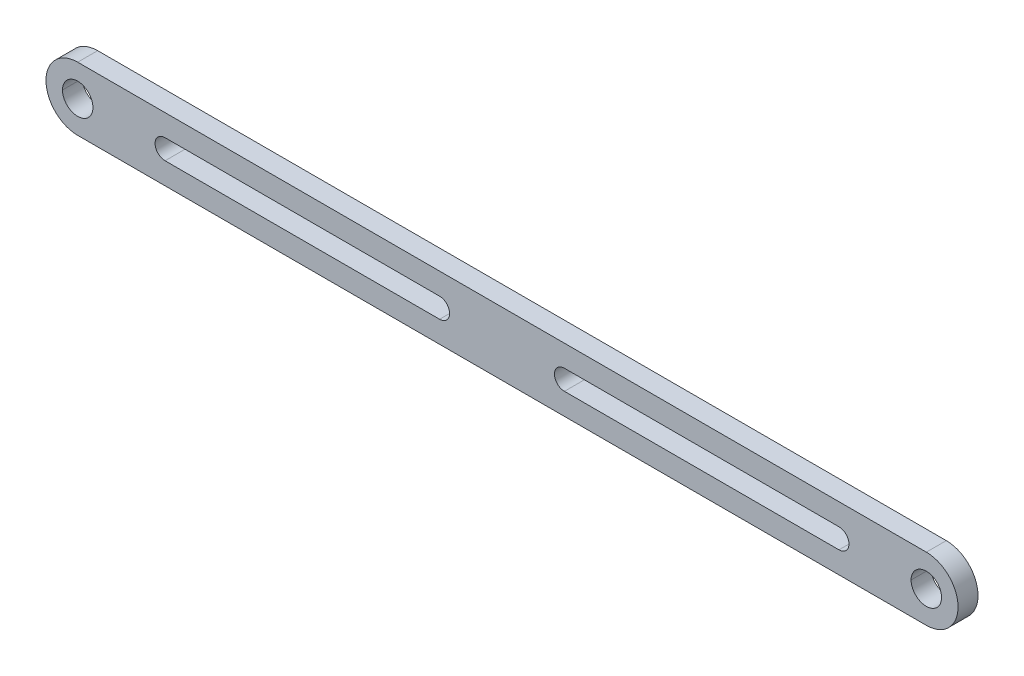
ISO-10303-21;
HEADER;
FILE_DESCRIPTION(('STEP AP214'),'2;1');
FILE_NAME('part.step','',(''),(''),'','','');
FILE_SCHEMA(('AUTOMOTIVE_DESIGN { 1 0 10303 214 1 1 1 1 }'));
ENDSEC;
DATA;
#1=APPLICATION_CONTEXT('core data for automotive mechanical design processes');
#2=APPLICATION_PROTOCOL_DEFINITION('international standard','automotive_design',2000,#1);
#3=PRODUCT_CONTEXT('',#1,'mechanical');
#4=PRODUCT('Part','Part','',(#3));
#5=PRODUCT_RELATED_PRODUCT_CATEGORY('part','',(#4));
#6=PRODUCT_DEFINITION_FORMATION('','',#4);
#7=PRODUCT_DEFINITION_CONTEXT('part definition',#1,'design');
#8=PRODUCT_DEFINITION('design','',#6,#7);
#9=PRODUCT_DEFINITION_SHAPE('','',#8);
#10=(LENGTH_UNIT() NAMED_UNIT(*) SI_UNIT(.MILLI.,.METRE.));
#11=(NAMED_UNIT(*) PLANE_ANGLE_UNIT() SI_UNIT($,.RADIAN.));
#12=(NAMED_UNIT(*) SI_UNIT($,.STERADIAN.) SOLID_ANGLE_UNIT());
#13=UNCERTAINTY_MEASURE_WITH_UNIT(LENGTH_MEASURE(1.E-05),#10,'distance_accuracy_value','');
#14=(GEOMETRIC_REPRESENTATION_CONTEXT(3) GLOBAL_UNCERTAINTY_ASSIGNED_CONTEXT((#13)) GLOBAL_UNIT_ASSIGNED_CONTEXT((#10,
#11,#12)) REPRESENTATION_CONTEXT('',''));
#15=CARTESIAN_POINT('',(0.,0.,0.));
#16=DIRECTION('',(0.,0.,1.));
#17=DIRECTION('',(1.,0.,0.));
#18=AXIS2_PLACEMENT_3D('',#15,#16,#17);
#19=CARTESIAN_POINT('',(67.5,0.,-2.));
#20=DIRECTION('',(0.,0.,1.));
#21=DIRECTION('',(1.,0.,0.));
#22=AXIS2_PLACEMENT_3D('',#19,#20,#21);
#23=CYLINDRICAL_SURFACE('',#22,2.);
#24=CARTESIAN_POINT('',(67.5,0.,-2.));
#25=DIRECTION('',(0.,0.,1.));
#26=DIRECTION('',(1.,0.,0.));
#27=AXIS2_PLACEMENT_3D('',#24,#25,#26);
#28=CIRCLE('',#27,2.);
#29=CARTESIAN_POINT('',(69.5,0.,-2.));
#30=VERTEX_POINT('',#29);
#31=CARTESIAN_POINT('',(67.5,2.,-2.));
#32=VERTEX_POINT('',#31);
#33=EDGE_CURVE('E41',#30,#32,#28,.T.);
#34=ORIENTED_EDGE('',*,*,#33,.F.);
#35=DIRECTION('',(0.,0.,1.));
#36=VECTOR('',#35,1.);
#37=CARTESIAN_POINT('',(69.5,0.,-2.));
#38=LINE('',#37,#36);
#39=CARTESIAN_POINT('',(69.5,0.,2.));
#40=VERTEX_POINT('',#39);
#41=EDGE_CURVE('E11',#30,#40,#38,.T.);
#42=ORIENTED_EDGE('',*,*,#41,.T.);
#43=CARTESIAN_POINT('',(67.5,0.,2.));
#44=DIRECTION('',(0.,0.,1.));
#45=DIRECTION('',(1.,0.,0.));
#46=AXIS2_PLACEMENT_3D('',#43,#44,#45);
#47=CIRCLE('',#46,2.);
#48=CARTESIAN_POINT('',(67.5,2.,2.));
#49=VERTEX_POINT('',#48);
#50=EDGE_CURVE('E27',#40,#49,#47,.T.);
#51=ORIENTED_EDGE('',*,*,#50,.T.);
#52=DIRECTION('',(0.,0.,1.));
#53=VECTOR('',#52,1.);
#54=CARTESIAN_POINT('',(67.5,2.,-2.));
#55=LINE('',#54,#53);
#56=EDGE_CURVE('E328',#32,#49,#55,.T.);
#57=ORIENTED_EDGE('',*,*,#56,.F.);
#58=EDGE_LOOP('',(#34,#42,#51,#57));
#59=FACE_BOUND('',#58,.T.);
#60=ADVANCED_FACE('F16',(#59),#23,.F.);
#61=CARTESIAN_POINT('',(-12.5,0.,-2.));
#62=DIRECTION('',(0.,0.,1.));
#63=DIRECTION('',(1.,0.,0.));
#64=AXIS2_PLACEMENT_3D('',#61,#62,#63);
#65=CYLINDRICAL_SURFACE('',#64,2.);
#66=CARTESIAN_POINT('',(-12.5,0.,-2.));
#67=DIRECTION('',(0.,0.,1.));
#68=DIRECTION('',(1.,0.,0.));
#69=AXIS2_PLACEMENT_3D('',#66,#67,#68);
#70=CIRCLE('',#69,2.);
#71=CARTESIAN_POINT('',(-10.5,0.,-2.));
#72=VERTEX_POINT('',#71);
#73=CARTESIAN_POINT('',(-12.5,2.,-2.));
#74=VERTEX_POINT('',#73);
#75=EDGE_CURVE('E207',#72,#74,#70,.T.);
#76=ORIENTED_EDGE('',*,*,#75,.F.);
#77=DIRECTION('',(0.,0.,1.));
#78=VECTOR('',#77,1.);
#79=CARTESIAN_POINT('',(-10.5,0.,-2.));
#80=LINE('',#79,#78);
#81=CARTESIAN_POINT('',(-10.5,0.,2.));
#82=VERTEX_POINT('',#81);
#83=EDGE_CURVE('E233',#72,#82,#80,.T.);
#84=ORIENTED_EDGE('',*,*,#83,.T.);
#85=CARTESIAN_POINT('',(-12.5,0.,2.));
#86=DIRECTION('',(0.,0.,1.));
#87=DIRECTION('',(1.,0.,0.));
#88=AXIS2_PLACEMENT_3D('',#85,#86,#87);
#89=CIRCLE('',#88,2.);
#90=CARTESIAN_POINT('',(-12.5,2.,2.));
#91=VERTEX_POINT('',#90);
#92=EDGE_CURVE('E237',#82,#91,#89,.T.);
#93=ORIENTED_EDGE('',*,*,#92,.T.);
#94=DIRECTION('',(0.,0.,1.));
#95=VECTOR('',#94,1.);
#96=CARTESIAN_POINT('',(-12.5,2.,-2.));
#97=LINE('',#96,#95);
#98=EDGE_CURVE('E266',#74,#91,#97,.T.);
#99=ORIENTED_EDGE('',*,*,#98,.F.);
#100=EDGE_LOOP('',(#76,#84,#93,#99));
#101=FACE_BOUND('',#100,.T.);
#102=ADVANCED_FACE('F424',(#101),#65,.F.);
#103=CARTESIAN_POINT('',(85.,0.,2.));
#104=DIRECTION('',(0.,0.,-1.));
#105=DIRECTION('',(-1.,0.,0.));
#106=AXIS2_PLACEMENT_3D('',#103,#104,#105);
#107=CYLINDRICAL_SURFACE('',#106,3.05);
#108=CARTESIAN_POINT('',(85.,0.,2.));
#109=DIRECTION('',(0.,0.,1.));
#110=DIRECTION('',(1.,0.,0.));
#111=AXIS2_PLACEMENT_3D('',#108,#109,#110);
#112=CIRCLE('',#111,3.05);
#113=CARTESIAN_POINT('',(81.95,0.,2.));
#114=VERTEX_POINT('',#113);
#115=CARTESIAN_POINT('',(88.05,0.,2.));
#116=VERTEX_POINT('',#115);
#117=EDGE_CURVE('E251',#114,#116,#112,.T.);
#118=ORIENTED_EDGE('',*,*,#117,.T.);
#119=DIRECTION('',(0.,0.,-1.));
#120=VECTOR('',#119,1.);
#121=CARTESIAN_POINT('',(88.05,0.,2.));
#122=LINE('',#121,#120);
#123=CARTESIAN_POINT('',(88.05,0.,-2.));
#124=VERTEX_POINT('',#123);
#125=EDGE_CURVE('E262',#116,#124,#122,.T.);
#126=ORIENTED_EDGE('',*,*,#125,.T.);
#127=CARTESIAN_POINT('',(85.,0.,-2.));
#128=DIRECTION('',(0.,0.,1.));
#129=DIRECTION('',(1.,0.,0.));
#130=AXIS2_PLACEMENT_3D('',#127,#128,#129);
#131=CIRCLE('',#130,3.05);
#132=CARTESIAN_POINT('',(81.95,0.,-2.));
#133=VERTEX_POINT('',#132);
#134=EDGE_CURVE('E183',#133,#124,#131,.T.);
#135=ORIENTED_EDGE('',*,*,#134,.F.);
#136=DIRECTION('',(0.,0.,-1.));
#137=VECTOR('',#136,1.);
#138=CARTESIAN_POINT('',(81.95,0.,2.));
#139=LINE('',#138,#137);
#140=EDGE_CURVE('E278',#114,#133,#139,.T.);
#141=ORIENTED_EDGE('',*,*,#140,.F.);
#142=EDGE_LOOP('',(#118,#126,#135,#141));
#143=FACE_BOUND('',#142,.T.);
#144=ADVANCED_FACE('F429',(#143),#107,.F.);
#145=CARTESIAN_POINT('',(-85.,0.,2.));
#146=DIRECTION('',(0.,0.,-1.));
#147=DIRECTION('',(-1.,0.,0.));
#148=AXIS2_PLACEMENT_3D('',#145,#146,#147);
#149=CYLINDRICAL_SURFACE('',#148,3.05);
#150=CARTESIAN_POINT('',(-85.,0.,2.));
#151=DIRECTION('',(0.,0.,1.));
#152=DIRECTION('',(1.,0.,0.));
#153=AXIS2_PLACEMENT_3D('',#150,#151,#152);
#154=CIRCLE('',#153,3.05);
#155=CARTESIAN_POINT('',(-88.05,0.,2.));
#156=VERTEX_POINT('',#155);
#157=CARTESIAN_POINT('',(-81.95,0.,2.));
#158=VERTEX_POINT('',#157);
#159=EDGE_CURVE('E173',#156,#158,#154,.T.);
#160=ORIENTED_EDGE('',*,*,#159,.T.);
#161=DIRECTION('',(0.,0.,-1.));
#162=VECTOR('',#161,1.);
#163=CARTESIAN_POINT('',(-81.95,0.,2.));
#164=LINE('',#163,#162);
#165=CARTESIAN_POINT('',(-81.95,0.,-2.));
#166=VERTEX_POINT('',#165);
#167=EDGE_CURVE('E170',#158,#166,#164,.T.);
#168=ORIENTED_EDGE('',*,*,#167,.T.);
#169=CARTESIAN_POINT('',(-85.,0.,-2.));
#170=DIRECTION('',(0.,0.,1.));
#171=DIRECTION('',(1.,0.,0.));
#172=AXIS2_PLACEMENT_3D('',#169,#170,#171);
#173=CIRCLE('',#172,3.05);
#174=CARTESIAN_POINT('',(-88.05,0.,-2.));
#175=VERTEX_POINT('',#174);
#176=EDGE_CURVE('E158',#175,#166,#173,.T.);
#177=ORIENTED_EDGE('',*,*,#176,.F.);
#178=DIRECTION('',(0.,0.,-1.));
#179=VECTOR('',#178,1.);
#180=CARTESIAN_POINT('',(-88.05,0.,2.));
#181=LINE('',#180,#179);
#182=EDGE_CURVE('E181',#156,#175,#181,.T.);
#183=ORIENTED_EDGE('',*,*,#182,.F.);
#184=EDGE_LOOP('',(#160,#168,#177,#183));
#185=FACE_BOUND('',#184,.T.);
#186=ADVANCED_FACE('F171',(#185),#149,.F.);
#187=CARTESIAN_POINT('',(-85.,0.,2.));
#188=DIRECTION('',(0.,0.,-1.));
#189=DIRECTION('',(-1.,0.,0.));
#190=AXIS2_PLACEMENT_3D('',#187,#188,#189);
#191=CYLINDRICAL_SURFACE('',#190,6.35);
#192=CARTESIAN_POINT('',(-85.,0.,2.));
#193=DIRECTION('',(0.,0.,1.));
#194=DIRECTION('',(1.,0.,0.));
#195=AXIS2_PLACEMENT_3D('',#192,#193,#194);
#196=CIRCLE('',#195,6.35);
#197=CARTESIAN_POINT('',(-91.35,0.,2.));
#198=VERTEX_POINT('',#197);
#199=CARTESIAN_POINT('',(-85.,-6.35,2.));
#200=VERTEX_POINT('',#199);
#201=EDGE_CURVE('E238',#198,#200,#196,.T.);
#202=ORIENTED_EDGE('',*,*,#201,.F.);
#203=DIRECTION('',(0.,0.,-1.));
#204=VECTOR('',#203,1.);
#205=CARTESIAN_POINT('',(-91.35,0.,2.));
#206=LINE('',#205,#204);
#207=CARTESIAN_POINT('',(-91.35,0.,-2.));
#208=VERTEX_POINT('',#207);
#209=EDGE_CURVE('E178',#198,#208,#206,.T.);
#210=ORIENTED_EDGE('',*,*,#209,.T.);
#211=CARTESIAN_POINT('',(-85.,0.,-2.));
#212=DIRECTION('',(0.,0.,1.));
#213=DIRECTION('',(1.,0.,0.));
#214=AXIS2_PLACEMENT_3D('',#211,#212,#213);
#215=CIRCLE('',#214,6.35);
#216=CARTESIAN_POINT('',(-85.,-6.35,-2.));
#217=VERTEX_POINT('',#216);
#218=EDGE_CURVE('E319',#208,#217,#215,.T.);
#219=ORIENTED_EDGE('',*,*,#218,.T.);
#220=DIRECTION('',(0.,0.,-1.));
#221=VECTOR('',#220,1.);
#222=CARTESIAN_POINT('',(-85.,-6.35,2.));
#223=LINE('',#222,#221);
#224=EDGE_CURVE('E310',#200,#217,#223,.T.);
#225=ORIENTED_EDGE('',*,*,#224,.F.);
#226=EDGE_LOOP('',(#202,#210,#219,#225));
#227=FACE_BOUND('',#226,.T.);
#228=ADVANCED_FACE('F445',(#227),#191,.T.);
#229=CARTESIAN_POINT('',(-85.,0.,2.));
#230=DIRECTION('',(0.,0.,1.));
#231=DIRECTION('',(1.,0.,0.));
#232=AXIS2_PLACEMENT_3D('',#229,#230,#231);
#233=PLANE('',#232);
#234=CARTESIAN_POINT('',(-85.,0.,2.));
#235=DIRECTION('',(0.,0.,1.));
#236=DIRECTION('',(1.,0.,0.));
#237=AXIS2_PLACEMENT_3D('',#234,#235,#236);
#238=CIRCLE('',#237,6.35);
#239=CARTESIAN_POINT('',(-85.,6.35,2.));
#240=VERTEX_POINT('',#239);
#241=EDGE_CURVE('E242',#240,#198,#238,.T.);
#242=ORIENTED_EDGE('',*,*,#241,.T.);
#243=ORIENTED_EDGE('',*,*,#201,.T.);
#244=DIRECTION('',(1.,0.,0.));
#245=VECTOR('',#244,1.);
#246=CARTESIAN_POINT('',(-85.,-6.35,2.));
#247=LINE('',#246,#245);
#248=CARTESIAN_POINT('',(85.,-6.35,2.));
#249=VERTEX_POINT('',#248);
#250=EDGE_CURVE('E243',#200,#249,#247,.T.);
#251=ORIENTED_EDGE('',*,*,#250,.T.);
#252=CARTESIAN_POINT('',(85.,0.,2.));
#253=DIRECTION('',(0.,0.,1.));
#254=DIRECTION('',(1.,0.,0.));
#255=AXIS2_PLACEMENT_3D('',#252,#253,#254);
#256=CIRCLE('',#255,6.35);
#257=CARTESIAN_POINT('',(85.,6.35,2.));
#258=VERTEX_POINT('',#257);
#259=EDGE_CURVE('E247',#249,#258,#256,.T.);
#260=ORIENTED_EDGE('',*,*,#259,.T.);
#261=DIRECTION('',(-1.,0.,0.));
#262=VECTOR('',#261,1.);
#263=CARTESIAN_POINT('',(-85.,6.35,2.));
#264=LINE('',#263,#262);
#265=EDGE_CURVE('E270',#258,#240,#264,.T.);
#266=ORIENTED_EDGE('',*,*,#265,.T.);
#267=EDGE_LOOP('',(#242,#243,#251,#260,#266));
#268=FACE_BOUND('',#267,.T.);
#269=CARTESIAN_POINT('',(67.5,0.,2.));
#270=DIRECTION('',(0.,0.,1.));
#271=DIRECTION('',(1.,0.,0.));
#272=AXIS2_PLACEMENT_3D('',#269,#270,#271);
#273=CIRCLE('',#272,2.);
#274=CARTESIAN_POINT('',(67.5,-2.,2.));
#275=VERTEX_POINT('',#274);
#276=EDGE_CURVE('E196',#275,#40,#273,.T.);
#277=ORIENTED_EDGE('',*,*,#276,.F.);
#278=DIRECTION('',(1.,0.,0.));
#279=VECTOR('',#278,1.);
#280=CARTESIAN_POINT('',(67.5,-2.,2.));
#281=LINE('',#280,#279);
#282=CARTESIAN_POINT('',(12.5,-2.,2.));
#283=VERTEX_POINT('',#282);
#284=EDGE_CURVE('E201',#283,#275,#281,.T.);
#285=ORIENTED_EDGE('',*,*,#284,.F.);
#286=CARTESIAN_POINT('',(12.5,0.,2.));
#287=DIRECTION('',(0.,0.,1.));
#288=DIRECTION('',(1.,0.,0.));
#289=AXIS2_PLACEMENT_3D('',#286,#287,#288);
#290=CIRCLE('',#289,2.);
#291=CARTESIAN_POINT('',(12.5,2.,2.));
#292=VERTEX_POINT('',#291);
#293=EDGE_CURVE('E332',#292,#283,#290,.T.);
#294=ORIENTED_EDGE('',*,*,#293,.F.);
#295=DIRECTION('',(-1.,0.,0.));
#296=VECTOR('',#295,1.);
#297=CARTESIAN_POINT('',(67.5,2.,2.));
#298=LINE('',#297,#296);
#299=EDGE_CURVE('E333',#49,#292,#298,.T.);
#300=ORIENTED_EDGE('',*,*,#299,.F.);
#301=ORIENTED_EDGE('',*,*,#50,.F.);
#302=EDGE_LOOP('',(#277,#285,#294,#300,#301));
#303=FACE_BOUND('',#302,.T.);
#304=CARTESIAN_POINT('',(-12.5,0.,2.));
#305=DIRECTION('',(0.,0.,1.));
#306=DIRECTION('',(1.,0.,0.));
#307=AXIS2_PLACEMENT_3D('',#304,#305,#306);
#308=CIRCLE('',#307,2.);
#309=CARTESIAN_POINT('',(-12.5,-2.,2.));
#310=VERTEX_POINT('',#309);
#311=EDGE_CURVE('E955',#310,#82,#308,.T.);
#312=ORIENTED_EDGE('',*,*,#311,.F.);
#313=DIRECTION('',(1.,0.,0.));
#314=VECTOR('',#313,1.);
#315=CARTESIAN_POINT('',(-12.5,-2.,2.));
#316=LINE('',#315,#314);
#317=CARTESIAN_POINT('',(-67.5,-2.,2.));
#318=VERTEX_POINT('',#317);
#319=EDGE_CURVE('E304',#318,#310,#316,.T.);
#320=ORIENTED_EDGE('',*,*,#319,.F.);
#321=CARTESIAN_POINT('',(-67.5,0.,2.));
#322=DIRECTION('',(0.,0.,1.));
#323=DIRECTION('',(1.,0.,0.));
#324=AXIS2_PLACEMENT_3D('',#321,#322,#323);
#325=CIRCLE('',#324,2.);
#326=CARTESIAN_POINT('',(-67.5,2.,2.));
#327=VERTEX_POINT('',#326);
#328=EDGE_CURVE('E305',#327,#318,#325,.T.);
#329=ORIENTED_EDGE('',*,*,#328,.F.);
#330=DIRECTION('',(-1.,0.,0.));
#331=VECTOR('',#330,1.);
#332=CARTESIAN_POINT('',(-12.5,2.,2.));
#333=LINE('',#332,#331);
#334=EDGE_CURVE('E232',#91,#327,#333,.T.);
#335=ORIENTED_EDGE('',*,*,#334,.F.);
#336=ORIENTED_EDGE('',*,*,#92,.F.);
#337=EDGE_LOOP('',(#312,#320,#329,#335,#336));
#338=FACE_BOUND('',#337,.T.);
#339=ORIENTED_EDGE('',*,*,#159,.F.);
#340=CARTESIAN_POINT('',(-85.,0.,2.));
#341=DIRECTION('',(0.,0.,1.));
#342=DIRECTION('',(1.,0.,0.));
#343=AXIS2_PLACEMENT_3D('',#340,#341,#342);
#344=CIRCLE('',#343,3.05);
#345=EDGE_CURVE('E273',#158,#156,#344,.T.);
#346=ORIENTED_EDGE('',*,*,#345,.F.);
#347=EDGE_LOOP('',(#339,#346));
#348=FACE_BOUND('',#347,.T.);
#349=ORIENTED_EDGE('',*,*,#117,.F.);
#350=CARTESIAN_POINT('',(85.,0.,2.));
#351=DIRECTION('',(0.,0.,1.));
#352=DIRECTION('',(1.,0.,0.));
#353=AXIS2_PLACEMENT_3D('',#350,#351,#352);
#354=CIRCLE('',#353,3.05);
#355=EDGE_CURVE('E274',#116,#114,#354,.T.);
#356=ORIENTED_EDGE('',*,*,#355,.F.);
#357=EDGE_LOOP('',(#349,#356));
#358=FACE_BOUND('',#357,.T.);
#359=ADVANCED_FACE('F347',(#268,#303,#338,#348,#358),#233,.T.);
#360=CARTESIAN_POINT('',(-85.,0.,-2.));
#361=DIRECTION('',(0.,0.,1.));
#362=DIRECTION('',(1.,0.,0.));
#363=AXIS2_PLACEMENT_3D('',#360,#361,#362);
#364=PLANE('',#363);
#365=CARTESIAN_POINT('',(-85.,0.,-2.));
#366=DIRECTION('',(0.,0.,1.));
#367=DIRECTION('',(1.,0.,0.));
#368=AXIS2_PLACEMENT_3D('',#365,#366,#367);
#369=CIRCLE('',#368,6.35);
#370=CARTESIAN_POINT('',(-85.,6.35,-2.));
#371=VERTEX_POINT('',#370);
#372=EDGE_CURVE('E294',#371,#208,#369,.T.);
#373=ORIENTED_EDGE('',*,*,#372,.F.);
#374=DIRECTION('',(-1.,0.,0.));
#375=VECTOR('',#374,1.);
#376=CARTESIAN_POINT('',(-85.,6.35,-2.));
#377=LINE('',#376,#375);
#378=CARTESIAN_POINT('',(85.,6.35,-2.));
#379=VERTEX_POINT('',#378);
#380=EDGE_CURVE('E20',#379,#371,#377,.T.);
#381=ORIENTED_EDGE('',*,*,#380,.F.);
#382=CARTESIAN_POINT('',(85.,0.,-2.));
#383=DIRECTION('',(0.,0.,1.));
#384=DIRECTION('',(1.,0.,0.));
#385=AXIS2_PLACEMENT_3D('',#382,#383,#384);
#386=CIRCLE('',#385,6.35);
#387=CARTESIAN_POINT('',(85.,-6.35,-2.));
#388=VERTEX_POINT('',#387);
#389=EDGE_CURVE('E299',#388,#379,#386,.T.);
#390=ORIENTED_EDGE('',*,*,#389,.F.);
#391=DIRECTION('',(1.,0.,0.));
#392=VECTOR('',#391,1.);
#393=CARTESIAN_POINT('',(-85.,-6.35,-2.));
#394=LINE('',#393,#392);
#395=EDGE_CURVE('E306',#217,#388,#394,.T.);
#396=ORIENTED_EDGE('',*,*,#395,.F.);
#397=ORIENTED_EDGE('',*,*,#218,.F.);
#398=EDGE_LOOP('',(#373,#381,#390,#396,#397));
#399=FACE_BOUND('',#398,.T.);
#400=DIRECTION('',(1.,0.,0.));
#401=VECTOR('',#400,1.);
#402=CARTESIAN_POINT('',(67.5,-2.,-2.));
#403=LINE('',#402,#401);
#404=CARTESIAN_POINT('',(12.5,-2.,-2.));
#405=VERTEX_POINT('',#404);
#406=CARTESIAN_POINT('',(67.5,-2.,-2.));
#407=VERTEX_POINT('',#406);
#408=EDGE_CURVE('E279',#405,#407,#403,.T.);
#409=ORIENTED_EDGE('',*,*,#408,.T.);
#410=CARTESIAN_POINT('',(67.5,0.,-2.));
#411=DIRECTION('',(0.,0.,1.));
#412=DIRECTION('',(1.,0.,0.));
#413=AXIS2_PLACEMENT_3D('',#410,#411,#412);
#414=CIRCLE('',#413,2.);
#415=EDGE_CURVE('E283',#407,#30,#414,.T.);
#416=ORIENTED_EDGE('',*,*,#415,.T.);
#417=ORIENTED_EDGE('',*,*,#33,.T.);
#418=DIRECTION('',(-1.,0.,0.));
#419=VECTOR('',#418,1.);
#420=CARTESIAN_POINT('',(67.5,2.,-2.));
#421=LINE('',#420,#419);
#422=CARTESIAN_POINT('',(12.5,2.,-2.));
#423=VERTEX_POINT('',#422);
#424=EDGE_CURVE('E252',#32,#423,#421,.T.);
#425=ORIENTED_EDGE('',*,*,#424,.T.);
#426=CARTESIAN_POINT('',(12.5,0.,-2.));
#427=DIRECTION('',(0.,0.,1.));
#428=DIRECTION('',(1.,0.,0.));
#429=AXIS2_PLACEMENT_3D('',#426,#427,#428);
#430=CIRCLE('',#429,2.);
#431=EDGE_CURVE('E194',#423,#405,#430,.T.);
#432=ORIENTED_EDGE('',*,*,#431,.T.);
#433=EDGE_LOOP('',(#409,#416,#417,#425,#432));
#434=FACE_BOUND('',#433,.T.);
#435=DIRECTION('',(1.,0.,0.));
#436=VECTOR('',#435,1.);
#437=CARTESIAN_POINT('',(-12.5,-2.,-2.));
#438=LINE('',#437,#436);
#439=CARTESIAN_POINT('',(-67.5,-2.,-2.));
#440=VERTEX_POINT('',#439);
#441=CARTESIAN_POINT('',(-12.5,-2.,-2.));
#442=VERTEX_POINT('',#441);
#443=EDGE_CURVE('E314',#440,#442,#438,.T.);
#444=ORIENTED_EDGE('',*,*,#443,.T.);
#445=CARTESIAN_POINT('',(-12.5,0.,-2.));
#446=DIRECTION('',(0.,0.,1.));
#447=DIRECTION('',(1.,0.,0.));
#448=AXIS2_PLACEMENT_3D('',#445,#446,#447);
#449=CIRCLE('',#448,2.);
#450=EDGE_CURVE('E217',#442,#72,#449,.T.);
#451=ORIENTED_EDGE('',*,*,#450,.T.);
#452=ORIENTED_EDGE('',*,*,#75,.T.);
#453=DIRECTION('',(-1.,0.,0.));
#454=VECTOR('',#453,1.);
#455=CARTESIAN_POINT('',(-12.5,2.,-2.));
#456=LINE('',#455,#454);
#457=CARTESIAN_POINT('',(-67.5,2.,-2.));
#458=VERTEX_POINT('',#457);
#459=EDGE_CURVE('E204',#74,#458,#456,.T.);
#460=ORIENTED_EDGE('',*,*,#459,.T.);
#461=CARTESIAN_POINT('',(-67.5,0.,-2.));
#462=DIRECTION('',(0.,0.,1.));
#463=DIRECTION('',(1.,0.,0.));
#464=AXIS2_PLACEMENT_3D('',#461,#462,#463);
#465=CIRCLE('',#464,2.);
#466=EDGE_CURVE('E167',#458,#440,#465,.T.);
#467=ORIENTED_EDGE('',*,*,#466,.T.);
#468=EDGE_LOOP('',(#444,#451,#452,#460,#467));
#469=FACE_BOUND('',#468,.T.);
#470=ORIENTED_EDGE('',*,*,#176,.T.);
#471=CARTESIAN_POINT('',(-85.,0.,-2.));
#472=DIRECTION('',(0.,0.,1.));
#473=DIRECTION('',(1.,0.,0.));
#474=AXIS2_PLACEMENT_3D('',#471,#472,#473);
#475=CIRCLE('',#474,3.05);
#476=EDGE_CURVE('E163',#166,#175,#475,.T.);
#477=ORIENTED_EDGE('',*,*,#476,.T.);
#478=EDGE_LOOP('',(#470,#477));
#479=FACE_BOUND('',#478,.T.);
#480=ORIENTED_EDGE('',*,*,#134,.T.);
#481=CARTESIAN_POINT('',(85.,0.,-2.));
#482=DIRECTION('',(0.,0.,1.));
#483=DIRECTION('',(1.,0.,0.));
#484=AXIS2_PLACEMENT_3D('',#481,#482,#483);
#485=CIRCLE('',#484,3.05);
#486=EDGE_CURVE('E190',#124,#133,#485,.T.);
#487=ORIENTED_EDGE('',*,*,#486,.T.);
#488=EDGE_LOOP('',(#480,#487));
#489=FACE_BOUND('',#488,.T.);
#490=ADVANCED_FACE('F160',(#399,#434,#469,#479,#489),#364,.F.);
#491=CARTESIAN_POINT('',(-85.,0.,2.));
#492=DIRECTION('',(0.,0.,-1.));
#493=DIRECTION('',(-1.,0.,0.));
#494=AXIS2_PLACEMENT_3D('',#491,#492,#493);
#495=CYLINDRICAL_SURFACE('',#494,6.35);
#496=ORIENTED_EDGE('',*,*,#209,.F.);
#497=ORIENTED_EDGE('',*,*,#241,.F.);
#498=DIRECTION('',(0.,0.,-1.));
#499=VECTOR('',#498,1.);
#500=CARTESIAN_POINT('',(-85.,6.35,2.));
#501=LINE('',#500,#499);
#502=EDGE_CURVE('E290',#240,#371,#501,.T.);
#503=ORIENTED_EDGE('',*,*,#502,.T.);
#504=ORIENTED_EDGE('',*,*,#372,.T.);
#505=EDGE_LOOP('',(#496,#497,#503,#504));
#506=FACE_BOUND('',#505,.T.);
#507=ADVANCED_FACE('F377',(#506),#495,.T.);
#508=CARTESIAN_POINT('',(-85.,-6.35,2.));
#509=DIRECTION('',(0.,1.,0.));
#510=DIRECTION('',(1.,0.,0.));
#511=AXIS2_PLACEMENT_3D('',#508,#509,#510);
#512=PLANE('',#511);
#513=ORIENTED_EDGE('',*,*,#395,.T.);
#514=DIRECTION('',(0.,0.,-1.));
#515=VECTOR('',#514,1.);
#516=CARTESIAN_POINT('',(85.,-6.35,2.));
#517=LINE('',#516,#515);
#518=EDGE_CURVE('E295',#249,#388,#517,.T.);
#519=ORIENTED_EDGE('',*,*,#518,.F.);
#520=ORIENTED_EDGE('',*,*,#250,.F.);
#521=ORIENTED_EDGE('',*,*,#224,.T.);
#522=EDGE_LOOP('',(#513,#519,#520,#521));
#523=FACE_BOUND('',#522,.T.);
#524=ADVANCED_FACE('F418',(#523),#512,.F.);
#525=CARTESIAN_POINT('',(85.,0.,2.));
#526=DIRECTION('',(0.,0.,-1.));
#527=DIRECTION('',(-1.,0.,0.));
#528=AXIS2_PLACEMENT_3D('',#525,#526,#527);
#529=CYLINDRICAL_SURFACE('',#528,6.35);
#530=ORIENTED_EDGE('',*,*,#389,.T.);
#531=DIRECTION('',(0.,0.,-1.));
#532=VECTOR('',#531,1.);
#533=CARTESIAN_POINT('',(85.,6.35,2.));
#534=LINE('',#533,#532);
#535=EDGE_CURVE('E315',#258,#379,#534,.T.);
#536=ORIENTED_EDGE('',*,*,#535,.F.);
#537=ORIENTED_EDGE('',*,*,#259,.F.);
#538=ORIENTED_EDGE('',*,*,#518,.T.);
#539=EDGE_LOOP('',(#530,#536,#537,#538));
#540=FACE_BOUND('',#539,.T.);
#541=ADVANCED_FACE('F409',(#540),#529,.T.);
#542=CARTESIAN_POINT('',(-85.,6.35,2.));
#543=DIRECTION('',(0.,-1.,0.));
#544=DIRECTION('',(0.,0.,-1.));
#545=AXIS2_PLACEMENT_3D('',#542,#543,#544);
#546=PLANE('',#545);
#547=ORIENTED_EDGE('',*,*,#380,.T.);
#548=ORIENTED_EDGE('',*,*,#502,.F.);
#549=ORIENTED_EDGE('',*,*,#265,.F.);
#550=ORIENTED_EDGE('',*,*,#535,.T.);
#551=EDGE_LOOP('',(#547,#548,#549,#550));
#552=FACE_BOUND('',#551,.T.);
#553=ADVANCED_FACE('F407',(#552),#546,.F.);
#554=CARTESIAN_POINT('',(-85.,0.,2.));
#555=DIRECTION('',(0.,0.,-1.));
#556=DIRECTION('',(-1.,0.,0.));
#557=AXIS2_PLACEMENT_3D('',#554,#555,#556);
#558=CYLINDRICAL_SURFACE('',#557,3.05);
#559=ORIENTED_EDGE('',*,*,#167,.F.);
#560=ORIENTED_EDGE('',*,*,#345,.T.);
#561=ORIENTED_EDGE('',*,*,#182,.T.);
#562=ORIENTED_EDGE('',*,*,#476,.F.);
#563=EDGE_LOOP('',(#559,#560,#561,#562));
#564=FACE_BOUND('',#563,.T.);
#565=ADVANCED_FACE('F180',(#564),#558,.F.);
#566=CARTESIAN_POINT('',(85.,0.,2.));
#567=DIRECTION('',(0.,0.,-1.));
#568=DIRECTION('',(-1.,0.,0.));
#569=AXIS2_PLACEMENT_3D('',#566,#567,#568);
#570=CYLINDRICAL_SURFACE('',#569,3.05);
#571=ORIENTED_EDGE('',*,*,#125,.F.);
#572=ORIENTED_EDGE('',*,*,#355,.T.);
#573=ORIENTED_EDGE('',*,*,#140,.T.);
#574=ORIENTED_EDGE('',*,*,#486,.F.);
#575=EDGE_LOOP('',(#571,#572,#573,#574));
#576=FACE_BOUND('',#575,.T.);
#577=ADVANCED_FACE('F416',(#576),#570,.F.);
#578=CARTESIAN_POINT('',(-12.5,0.,-2.));
#579=DIRECTION('',(0.,0.,1.));
#580=DIRECTION('',(1.,0.,0.));
#581=AXIS2_PLACEMENT_3D('',#578,#579,#580);
#582=CYLINDRICAL_SURFACE('',#581,2.);
#583=ORIENTED_EDGE('',*,*,#83,.F.);
#584=ORIENTED_EDGE('',*,*,#450,.F.);
#585=DIRECTION('',(0.,0.,1.));
#586=VECTOR('',#585,1.);
#587=CARTESIAN_POINT('',(-12.5,-2.,-2.));
#588=LINE('',#587,#586);
#589=EDGE_CURVE('E485',#442,#310,#588,.T.);
#590=ORIENTED_EDGE('',*,*,#589,.T.);
#591=ORIENTED_EDGE('',*,*,#311,.T.);
#592=EDGE_LOOP('',(#583,#584,#590,#591));
#593=FACE_BOUND('',#592,.T.);
#594=ADVANCED_FACE('F656',(#593),#582,.F.);
#595=CARTESIAN_POINT('',(-12.5,-2.,-2.));
#596=DIRECTION('',(0.,-1.,0.));
#597=DIRECTION('',(0.,0.,-1.));
#598=AXIS2_PLACEMENT_3D('',#595,#596,#597);
#599=PLANE('',#598);
#600=ORIENTED_EDGE('',*,*,#589,.F.);
#601=ORIENTED_EDGE('',*,*,#443,.F.);
#602=DIRECTION('',(0.,0.,1.));
#603=VECTOR('',#602,1.);
#604=CARTESIAN_POINT('',(-67.5,-2.,-2.));
#605=LINE('',#604,#603);
#606=EDGE_CURVE('E369',#440,#318,#605,.T.);
#607=ORIENTED_EDGE('',*,*,#606,.T.);
#608=ORIENTED_EDGE('',*,*,#319,.T.);
#609=EDGE_LOOP('',(#600,#601,#607,#608));
#610=FACE_BOUND('',#609,.T.);
#611=ADVANCED_FACE('F651',(#610),#599,.F.);
#612=CARTESIAN_POINT('',(-67.5,0.,-2.));
#613=DIRECTION('',(0.,0.,1.));
#614=DIRECTION('',(1.,0.,0.));
#615=AXIS2_PLACEMENT_3D('',#612,#613,#614);
#616=CYLINDRICAL_SURFACE('',#615,2.);
#617=ORIENTED_EDGE('',*,*,#606,.F.);
#618=ORIENTED_EDGE('',*,*,#466,.F.);
#619=DIRECTION('',(0.,0.,1.));
#620=VECTOR('',#619,1.);
#621=CARTESIAN_POINT('',(-67.5,2.,-2.));
#622=LINE('',#621,#620);
#623=EDGE_CURVE('E300',#458,#327,#622,.T.);
#624=ORIENTED_EDGE('',*,*,#623,.T.);
#625=ORIENTED_EDGE('',*,*,#328,.T.);
#626=EDGE_LOOP('',(#617,#618,#624,#625));
#627=FACE_BOUND('',#626,.T.);
#628=ADVANCED_FACE('F655',(#627),#616,.F.);
#629=CARTESIAN_POINT('',(-12.5,2.,-2.));
#630=DIRECTION('',(0.,1.,0.));
#631=DIRECTION('',(1.,0.,0.));
#632=AXIS2_PLACEMENT_3D('',#629,#630,#631);
#633=PLANE('',#632);
#634=ORIENTED_EDGE('',*,*,#623,.F.);
#635=ORIENTED_EDGE('',*,*,#459,.F.);
#636=ORIENTED_EDGE('',*,*,#98,.T.);
#637=ORIENTED_EDGE('',*,*,#334,.T.);
#638=EDGE_LOOP('',(#634,#635,#636,#637));
#639=FACE_BOUND('',#638,.T.);
#640=ADVANCED_FACE('F436',(#639),#633,.F.);
#641=CARTESIAN_POINT('',(67.5,0.,-2.));
#642=DIRECTION('',(0.,0.,1.));
#643=DIRECTION('',(1.,0.,0.));
#644=AXIS2_PLACEMENT_3D('',#641,#642,#643);
#645=CYLINDRICAL_SURFACE('',#644,2.);
#646=ORIENTED_EDGE('',*,*,#41,.F.);
#647=ORIENTED_EDGE('',*,*,#415,.F.);
#648=DIRECTION('',(0.,0.,1.));
#649=VECTOR('',#648,1.);
#650=CARTESIAN_POINT('',(67.5,-2.,-2.));
#651=LINE('',#650,#649);
#652=EDGE_CURVE('E199',#407,#275,#651,.T.);
#653=ORIENTED_EDGE('',*,*,#652,.T.);
#654=ORIENTED_EDGE('',*,*,#276,.T.);
#655=EDGE_LOOP('',(#646,#647,#653,#654));
#656=FACE_BOUND('',#655,.T.);
#657=ADVANCED_FACE('F432',(#656),#645,.F.);
#658=CARTESIAN_POINT('',(67.5,-2.,-2.));
#659=DIRECTION('',(0.,-1.,0.));
#660=DIRECTION('',(0.,0.,-1.));
#661=AXIS2_PLACEMENT_3D('',#658,#659,#660);
#662=PLANE('',#661);
#663=ORIENTED_EDGE('',*,*,#652,.F.);
#664=ORIENTED_EDGE('',*,*,#408,.F.);
#665=DIRECTION('',(0.,0.,1.));
#666=VECTOR('',#665,1.);
#667=CARTESIAN_POINT('',(12.5,-2.,-2.));
#668=LINE('',#667,#666);
#669=EDGE_CURVE('E200',#405,#283,#668,.T.);
#670=ORIENTED_EDGE('',*,*,#669,.T.);
#671=ORIENTED_EDGE('',*,*,#284,.T.);
#672=EDGE_LOOP('',(#663,#664,#670,#671));
#673=FACE_BOUND('',#672,.T.);
#674=ADVANCED_FACE('F435',(#673),#662,.F.);
#675=CARTESIAN_POINT('',(12.5,0.,-2.));
#676=DIRECTION('',(0.,0.,1.));
#677=DIRECTION('',(1.,0.,0.));
#678=AXIS2_PLACEMENT_3D('',#675,#676,#677);
#679=CYLINDRICAL_SURFACE('',#678,2.);
#680=ORIENTED_EDGE('',*,*,#669,.F.);
#681=ORIENTED_EDGE('',*,*,#431,.F.);
#682=DIRECTION('',(0.,0.,1.));
#683=VECTOR('',#682,1.);
#684=CARTESIAN_POINT('',(12.5,2.,-2.));
#685=LINE('',#684,#683);
#686=EDGE_CURVE('E203',#423,#292,#685,.T.);
#687=ORIENTED_EDGE('',*,*,#686,.T.);
#688=ORIENTED_EDGE('',*,*,#293,.T.);
#689=EDGE_LOOP('',(#680,#681,#687,#688));
#690=FACE_BOUND('',#689,.T.);
#691=ADVANCED_FACE('F18',(#690),#679,.F.);
#692=CARTESIAN_POINT('',(67.5,2.,-2.));
#693=DIRECTION('',(0.,1.,0.));
#694=DIRECTION('',(1.,0.,0.));
#695=AXIS2_PLACEMENT_3D('',#692,#693,#694);
#696=PLANE('',#695);
#697=ORIENTED_EDGE('',*,*,#686,.F.);
#698=ORIENTED_EDGE('',*,*,#424,.F.);
#699=ORIENTED_EDGE('',*,*,#56,.T.);
#700=ORIENTED_EDGE('',*,*,#299,.T.);
#701=EDGE_LOOP('',(#697,#698,#699,#700));
#702=FACE_BOUND('',#701,.T.);
#703=ADVANCED_FACE('F695',(#702),#696,.F.);
#704=CLOSED_SHELL('',(#60,#102,#144,#186,#228,#359,#490,#507,#524,#541,#553,#565,#577,#594,#611,
#628,#640,#657,#674,#691,#703));
#705=MANIFOLD_SOLID_BREP('B1',#704);
#706=ADVANCED_BREP_SHAPE_REPRESENTATION('',(#18,#705),#14);
#707=SHAPE_DEFINITION_REPRESENTATION(#9,#706);
ENDSEC;
END-ISO-10303-21;
